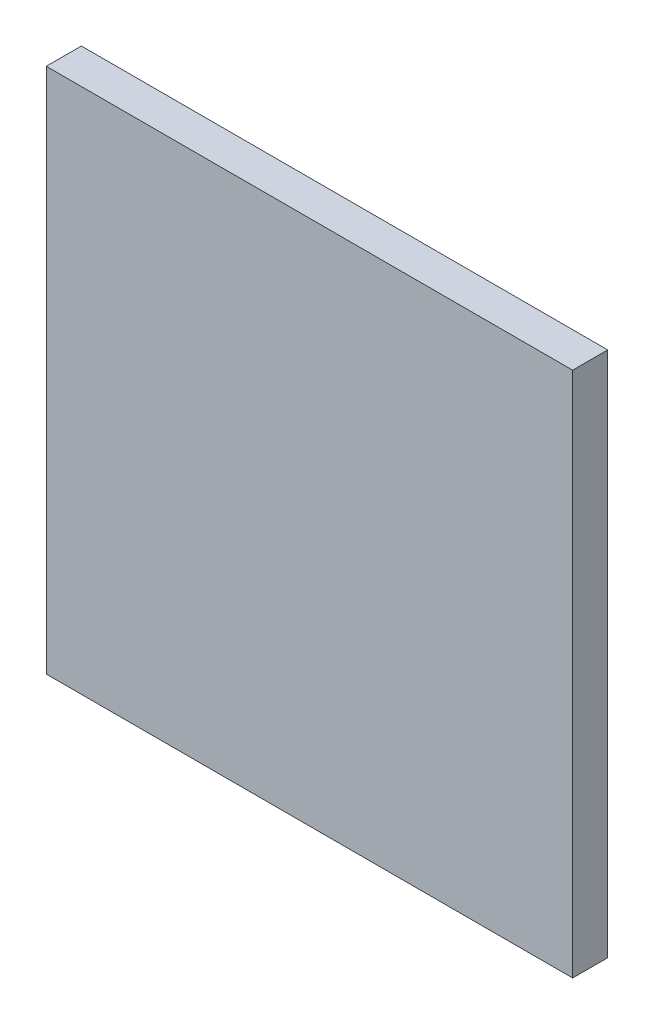
ISO-10303-21;
HEADER;
FILE_DESCRIPTION(('STEP AP214'),'2;1');
FILE_NAME('part.step','',(''),(''),'','','');
FILE_SCHEMA(('AUTOMOTIVE_DESIGN { 1 0 10303 214 1 1 1 1 }'));
ENDSEC;
DATA;
#1=APPLICATION_CONTEXT('core data for automotive mechanical design processes');
#2=APPLICATION_PROTOCOL_DEFINITION('international standard','automotive_design',2000,#1);
#3=PRODUCT_CONTEXT('',#1,'mechanical');
#4=PRODUCT('Part','Part','',(#3));
#5=PRODUCT_RELATED_PRODUCT_CATEGORY('part','',(#4));
#6=PRODUCT_DEFINITION_FORMATION('','',#4);
#7=PRODUCT_DEFINITION_CONTEXT('part definition',#1,'design');
#8=PRODUCT_DEFINITION('design','',#6,#7);
#9=PRODUCT_DEFINITION_SHAPE('','',#8);
#10=(LENGTH_UNIT() NAMED_UNIT(*) SI_UNIT(.MILLI.,.METRE.));
#11=(NAMED_UNIT(*) PLANE_ANGLE_UNIT() SI_UNIT($,.RADIAN.));
#12=(NAMED_UNIT(*) SI_UNIT($,.STERADIAN.) SOLID_ANGLE_UNIT());
#13=UNCERTAINTY_MEASURE_WITH_UNIT(LENGTH_MEASURE(1.E-05),#10,'distance_accuracy_value','');
#14=(GEOMETRIC_REPRESENTATION_CONTEXT(3) GLOBAL_UNCERTAINTY_ASSIGNED_CONTEXT((#13)) GLOBAL_UNIT_ASSIGNED_CONTEXT((#10,
#11,#12)) REPRESENTATION_CONTEXT('',''));
#15=CARTESIAN_POINT('',(0.,0.,0.));
#16=DIRECTION('',(0.,0.,1.));
#17=DIRECTION('',(1.,0.,0.));
#18=AXIS2_PLACEMENT_3D('',#15,#16,#17);
#19=CARTESIAN_POINT('',(0.,0.,19.05));
#20=DIRECTION('',(1.,0.,0.));
#21=DIRECTION('',(0.,0.,-1.));
#22=AXIS2_PLACEMENT_3D('',#19,#20,#21);
#23=PLANE('',#22);
#24=DIRECTION('',(0.,-1.,0.));
#25=VECTOR('',#24,1.);
#26=CARTESIAN_POINT('',(0.,0.,0.));
#27=LINE('',#26,#25);
#28=CARTESIAN_POINT('',(0.,285.75,0.));
#29=VERTEX_POINT('',#28);
#30=CARTESIAN_POINT('',(0.,0.,0.));
#31=VERTEX_POINT('',#30);
#32=EDGE_CURVE('E100',#29,#31,#27,.T.);
#33=ORIENTED_EDGE('',*,*,#32,.T.);
#34=DIRECTION('',(0.,0.,-1.));
#35=VECTOR('',#34,1.);
#36=CARTESIAN_POINT('',(0.,0.,19.05));
#37=LINE('',#36,#35);
#38=CARTESIAN_POINT('',(0.,0.,19.05));
#39=VERTEX_POINT('',#38);
#40=EDGE_CURVE('E11',#39,#31,#37,.T.);
#41=ORIENTED_EDGE('',*,*,#40,.F.);
#42=DIRECTION('',(0.,-1.,0.));
#43=VECTOR('',#42,1.);
#44=CARTESIAN_POINT('',(0.,0.,19.05));
#45=LINE('',#44,#43);
#46=CARTESIAN_POINT('',(0.,285.75,19.05));
#47=VERTEX_POINT('',#46);
#48=EDGE_CURVE('E88',#47,#39,#45,.T.);
#49=ORIENTED_EDGE('',*,*,#48,.F.);
#50=DIRECTION('',(0.,0.,-1.));
#51=VECTOR('',#50,1.);
#52=CARTESIAN_POINT('',(0.,285.75,19.05));
#53=LINE('',#52,#51);
#54=EDGE_CURVE('E96',#47,#29,#53,.T.);
#55=ORIENTED_EDGE('',*,*,#54,.T.);
#56=EDGE_LOOP('',(#33,#41,#49,#55));
#57=FACE_BOUND('',#56,.T.);
#58=ADVANCED_FACE('F37',(#57),#23,.F.);
#59=CARTESIAN_POINT('',(0.,0.,19.05));
#60=DIRECTION('',(0.,1.,0.));
#61=DIRECTION('',(0.,0.,1.));
#62=AXIS2_PLACEMENT_3D('',#59,#60,#61);
#63=PLANE('',#62);
#64=DIRECTION('',(1.,0.,0.));
#65=VECTOR('',#64,1.);
#66=CARTESIAN_POINT('',(0.,0.,0.));
#67=LINE('',#66,#65);
#68=CARTESIAN_POINT('',(285.75,0.,0.));
#69=VERTEX_POINT('',#68);
#70=EDGE_CURVE('E92',#31,#69,#67,.T.);
#71=ORIENTED_EDGE('',*,*,#70,.T.);
#72=DIRECTION('',(0.,0.,-1.));
#73=VECTOR('',#72,1.);
#74=CARTESIAN_POINT('',(285.75,0.,19.05));
#75=LINE('',#74,#73);
#76=CARTESIAN_POINT('',(285.75,0.,19.05));
#77=VERTEX_POINT('',#76);
#78=EDGE_CURVE('E45',#77,#69,#75,.T.);
#79=ORIENTED_EDGE('',*,*,#78,.F.);
#80=DIRECTION('',(1.,0.,0.));
#81=VECTOR('',#80,1.);
#82=CARTESIAN_POINT('',(0.,0.,19.05));
#83=LINE('',#82,#81);
#84=EDGE_CURVE('E83',#39,#77,#83,.T.);
#85=ORIENTED_EDGE('',*,*,#84,.F.);
#86=ORIENTED_EDGE('',*,*,#40,.T.);
#87=EDGE_LOOP('',(#71,#79,#85,#86));
#88=FACE_BOUND('',#87,.T.);
#89=ADVANCED_FACE('F91',(#88),#63,.F.);
#90=CARTESIAN_POINT('',(285.75,0.,19.05));
#91=DIRECTION('',(-1.,0.,0.));
#92=DIRECTION('',(0.,-1.,0.));
#93=AXIS2_PLACEMENT_3D('',#90,#91,#92);
#94=PLANE('',#93);
#95=DIRECTION('',(0.,1.,0.));
#96=VECTOR('',#95,1.);
#97=CARTESIAN_POINT('',(285.75,0.,0.));
#98=LINE('',#97,#96);
#99=CARTESIAN_POINT('',(285.75,285.75,0.));
#100=VERTEX_POINT('',#99);
#101=EDGE_CURVE('E70',#69,#100,#98,.T.);
#102=ORIENTED_EDGE('',*,*,#101,.T.);
#103=DIRECTION('',(0.,0.,-1.));
#104=VECTOR('',#103,1.);
#105=CARTESIAN_POINT('',(285.75,285.75,19.05));
#106=LINE('',#105,#104);
#107=CARTESIAN_POINT('',(285.75,285.75,19.05));
#108=VERTEX_POINT('',#107);
#109=EDGE_CURVE('E93',#108,#100,#106,.T.);
#110=ORIENTED_EDGE('',*,*,#109,.F.);
#111=DIRECTION('',(0.,1.,0.));
#112=VECTOR('',#111,1.);
#113=CARTESIAN_POINT('',(285.75,0.,19.05));
#114=LINE('',#113,#112);
#115=EDGE_CURVE('E86',#77,#108,#114,.T.);
#116=ORIENTED_EDGE('',*,*,#115,.F.);
#117=ORIENTED_EDGE('',*,*,#78,.T.);
#118=EDGE_LOOP('',(#102,#110,#116,#117));
#119=FACE_BOUND('',#118,.T.);
#120=ADVANCED_FACE('F94',(#119),#94,.F.);
#121=CARTESIAN_POINT('',(0.,285.75,19.05));
#122=DIRECTION('',(0.,-1.,0.));
#123=DIRECTION('',(0.,0.,-1.));
#124=AXIS2_PLACEMENT_3D('',#121,#122,#123);
#125=PLANE('',#124);
#126=DIRECTION('',(-1.,0.,0.));
#127=VECTOR('',#126,1.);
#128=CARTESIAN_POINT('',(0.,285.75,0.));
#129=LINE('',#128,#127);
#130=EDGE_CURVE('E76',#100,#29,#129,.T.);
#131=ORIENTED_EDGE('',*,*,#130,.T.);
#132=ORIENTED_EDGE('',*,*,#54,.F.);
#133=DIRECTION('',(-1.,0.,0.));
#134=VECTOR('',#133,1.);
#135=CARTESIAN_POINT('',(0.,285.75,19.05));
#136=LINE('',#135,#134);
#137=EDGE_CURVE('E53',#108,#47,#136,.T.);
#138=ORIENTED_EDGE('',*,*,#137,.F.);
#139=ORIENTED_EDGE('',*,*,#109,.T.);
#140=EDGE_LOOP('',(#131,#132,#138,#139));
#141=FACE_BOUND('',#140,.T.);
#142=ADVANCED_FACE('F107',(#141),#125,.F.);
#143=CARTESIAN_POINT('',(0.,0.,19.05));
#144=DIRECTION('',(0.,0.,-1.));
#145=DIRECTION('',(-1.,0.,0.));
#146=AXIS2_PLACEMENT_3D('',#143,#144,#145);
#147=PLANE('',#146);
#148=ORIENTED_EDGE('',*,*,#48,.T.);
#149=ORIENTED_EDGE('',*,*,#84,.T.);
#150=ORIENTED_EDGE('',*,*,#115,.T.);
#151=ORIENTED_EDGE('',*,*,#137,.T.);
#152=EDGE_LOOP('',(#148,#149,#150,#151));
#153=FACE_BOUND('',#152,.T.);
#154=ADVANCED_FACE('F84',(#153),#147,.F.);
#155=CARTESIAN_POINT('',(0.,0.,0.));
#156=DIRECTION('',(0.,0.,-1.));
#157=DIRECTION('',(-1.,0.,0.));
#158=AXIS2_PLACEMENT_3D('',#155,#156,#157);
#159=PLANE('',#158);
#160=ORIENTED_EDGE('',*,*,#32,.F.);
#161=ORIENTED_EDGE('',*,*,#130,.F.);
#162=ORIENTED_EDGE('',*,*,#101,.F.);
#163=ORIENTED_EDGE('',*,*,#70,.F.);
#164=EDGE_LOOP('',(#160,#161,#162,#163));
#165=FACE_BOUND('',#164,.T.);
#166=ADVANCED_FACE('F110',(#165),#159,.T.);
#167=CLOSED_SHELL('',(#58,#89,#120,#142,#154,#166));
#168=MANIFOLD_SOLID_BREP('B2',#167);
#169=ADVANCED_BREP_SHAPE_REPRESENTATION('',(#18,#168),#14);
#170=SHAPE_DEFINITION_REPRESENTATION(#9,#169);
ENDSEC;
END-ISO-10303-21;
